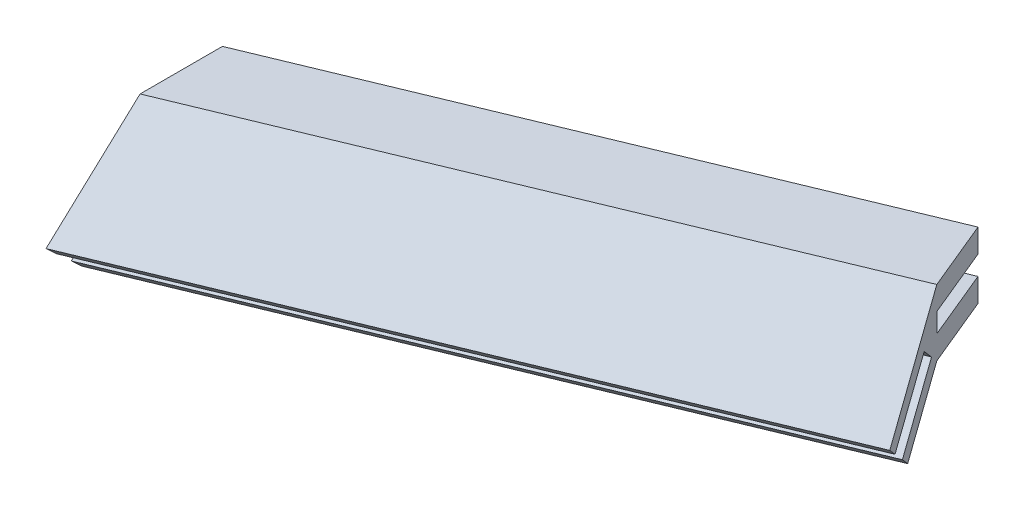
ISO-10303-21;
HEADER;
FILE_DESCRIPTION(('STEP AP214'),'2;1');
FILE_NAME('part.step','',(''),(''),'','','');
FILE_SCHEMA(('AUTOMOTIVE_DESIGN { 1 0 10303 214 1 1 1 1 }'));
ENDSEC;
DATA;
#1=APPLICATION_CONTEXT('core data for automotive mechanical design processes');
#2=APPLICATION_PROTOCOL_DEFINITION('international standard','automotive_design',2000,#1);
#3=PRODUCT_CONTEXT('',#1,'mechanical');
#4=PRODUCT('Part','Part','',(#3));
#5=PRODUCT_RELATED_PRODUCT_CATEGORY('part','',(#4));
#6=PRODUCT_DEFINITION_FORMATION('','',#4);
#7=PRODUCT_DEFINITION_CONTEXT('part definition',#1,'design');
#8=PRODUCT_DEFINITION('design','',#6,#7);
#9=PRODUCT_DEFINITION_SHAPE('','',#8);
#10=(LENGTH_UNIT() NAMED_UNIT(*) SI_UNIT(.MILLI.,.METRE.));
#11=(NAMED_UNIT(*) PLANE_ANGLE_UNIT() SI_UNIT($,.RADIAN.));
#12=(NAMED_UNIT(*) SI_UNIT($,.STERADIAN.) SOLID_ANGLE_UNIT());
#13=UNCERTAINTY_MEASURE_WITH_UNIT(LENGTH_MEASURE(1.E-05),#10,'distance_accuracy_value','');
#14=(GEOMETRIC_REPRESENTATION_CONTEXT(3) GLOBAL_UNCERTAINTY_ASSIGNED_CONTEXT((#13)) GLOBAL_UNIT_ASSIGNED_CONTEXT((#10,
#11,#12)) REPRESENTATION_CONTEXT('',''));
#15=CARTESIAN_POINT('',(0.,0.,0.));
#16=DIRECTION('',(0.,0.,1.));
#17=DIRECTION('',(1.,0.,0.));
#18=AXIS2_PLACEMENT_3D('',#15,#16,#17);
#19=CARTESIAN_POINT('',(-13.972297336363,38.284271247462,187.216606807487));
#20=DIRECTION('',(0.2705980500731,0.707106781186546,0.653281482438189));
#21=DIRECTION('',(0.,-0.678598344545848,0.734509555267754));
#22=AXIS2_PLACEMENT_3D('',#19,#20,#21);
#23=PLANE('',#22);
#24=DIRECTION('',(0.270598050073098,-0.707106781186549,0.653281482438187));
#25=VECTOR('',#24,1.);
#26=CARTESIAN_POINT('',(88.7481412148404,38.284271247462,144.668408026667));
#27=LINE('',#26,#25);
#28=CARTESIAN_POINT('',(93.0724640005659,26.9842712474619,155.108246744044));
#29=VERTEX_POINT('',#28);
#30=CARTESIAN_POINT('',(96.5902386515162,17.7918830920368,163.600906015741));
#31=VERTEX_POINT('',#30);
#32=EDGE_CURVE('E47',#29,#31,#27,.T.);
#33=ORIENTED_EDGE('',*,*,#32,.T.);
#34=DIRECTION('',(0.923879532511287,0.,-0.38268343236509));
#35=VECTOR('',#34,1.);
#36=CARTESIAN_POINT('',(-10.4545226854128,17.7918830920367,207.940297942488));
#37=LINE('',#36,#35);
#38=CARTESIAN_POINT('',(-3.14837533343908,17.7918830920367,204.913992620604));
#39=VERTEX_POINT('',#38);
#40=EDGE_CURVE('E62',#39,#31,#37,.T.);
#41=ORIENTED_EDGE('',*,*,#40,.F.);
#42=DIRECTION('',(0.,0.678598344545848,-0.734509555267754));
#43=VECTOR('',#42,1.);
#44=CARTESIAN_POINT('',(-3.14837533343908,-8.0485775527046,232.883505674435));
#45=LINE('',#44,#43);
#46=CARTESIAN_POINT('',(-3.14837533343907,26.9842712474619,194.964223379112));
#47=VERTEX_POINT('',#46);
#48=EDGE_CURVE('E176',#39,#47,#45,.T.);
#49=ORIENTED_EDGE('',*,*,#48,.T.);
#50=DIRECTION('',(0.923879532511287,0.,-0.38268343236509));
#51=VECTOR('',#50,1.);
#52=CARTESIAN_POINT('',(-13.972297336363,26.9842712474619,199.447638670791));
#53=LINE('',#52,#51);
#54=EDGE_CURVE('E170',#47,#29,#53,.T.);
#55=ORIENTED_EDGE('',*,*,#54,.T.);
#56=EDGE_LOOP('',(#33,#41,#49,#55));
#57=FACE_BOUND('',#56,.T.);
#58=ADVANCED_FACE('F38',(#57),#23,.F.);
#59=CARTESIAN_POINT('',(93.0724640005659,38.284271247462,155.108246744044));
#60=DIRECTION('',(-0.270598050073099,-0.707106781186546,-0.653281482438189));
#61=DIRECTION('',(0.,0.678598344545848,-0.734509555267754));
#62=AXIS2_PLACEMENT_3D('',#59,#60,#61);
#63=PLANE('',#62);
#64=DIRECTION('',(0.,-0.678598344545848,0.734509555267754));
#65=VECTOR('',#64,1.);
#66=CARTESIAN_POINT('',(-3.14837533343908,-5.16386609532728,241.992148356179));
#67=LINE('',#66,#65);
#68=CARTESIAN_POINT('',(-3.14837533343907,38.284271247462,194.964223379112));
#69=VERTEX_POINT('',#68);
#70=CARTESIAN_POINT('',(-3.14837533343908,23.4418830920367,211.029508552256));
#71=VERTEX_POINT('',#70);
#72=EDGE_CURVE('E182',#69,#71,#67,.T.);
#73=ORIENTED_EDGE('',*,*,#72,.T.);
#74=DIRECTION('',(0.923879532511287,0.,-0.38268343236509));
#75=VECTOR('',#74,1.);
#76=CARTESIAN_POINT('',(-8.29236129255004,23.4418830920367,213.160217301176));
#77=LINE('',#76,#75);
#78=CARTESIAN_POINT('',(98.7524000443789,23.4418830920367,168.820825374429));
#79=VERTEX_POINT('',#78);
#80=EDGE_CURVE('E224',#71,#79,#77,.T.);
#81=ORIENTED_EDGE('',*,*,#80,.T.);
#82=DIRECTION('',(0.270598050073098,-0.707106781186549,0.653281482438187));
#83=VECTOR('',#82,1.);
#84=CARTESIAN_POINT('',(93.0724640005659,38.284271247462,155.108246744044));
#85=LINE('',#84,#83);
#86=CARTESIAN_POINT('',(93.0724640005659,38.284271247462,155.108246744044));
#87=VERTEX_POINT('',#86);
#88=EDGE_CURVE('E11',#87,#79,#85,.T.);
#89=ORIENTED_EDGE('',*,*,#88,.F.);
#90=DIRECTION('',(0.923879532511287,0.,-0.38268343236509));
#91=VECTOR('',#90,1.);
#92=CARTESIAN_POINT('',(93.0724640005659,38.284271247462,155.108246744044));
#93=LINE('',#92,#91);
#94=EDGE_CURVE('E167',#69,#87,#93,.T.);
#95=ORIENTED_EDGE('',*,*,#94,.F.);
#96=EDGE_LOOP('',(#73,#81,#89,#95));
#97=FACE_BOUND('',#96,.T.);
#98=ADVANCED_FACE('F326',(#97),#63,.F.);
#99=CARTESIAN_POINT('',(-3.14837533343908,0.,225.578897968319));
#100=DIRECTION('',(1.,0.,0.));
#101=DIRECTION('',(0.,0.,-1.));
#102=AXIS2_PLACEMENT_3D('',#99,#100,#101);
#103=PLANE('',#102);
#104=DIRECTION('',(0.,0.,-1.));
#105=VECTOR('',#104,1.);
#106=CARTESIAN_POINT('',(-3.14837533343908,30.9842712474619,225.578897968319));
#107=LINE('',#106,#105);
#108=CARTESIAN_POINT('',(-3.14837533343907,30.9842712474619,194.964223379112));
#109=VERTEX_POINT('',#108);
#110=CARTESIAN_POINT('',(-3.14837533343908,30.9842712474619,180.89312477531));
#111=VERTEX_POINT('',#110);
#112=EDGE_CURVE('E203',#109,#111,#107,.T.);
#113=ORIENTED_EDGE('',*,*,#112,.T.);
#114=DIRECTION('',(0.,-1.,0.));
#115=VECTOR('',#114,1.);
#116=CARTESIAN_POINT('',(-3.14837533343908,0.,180.89312477531));
#117=LINE('',#116,#115);
#118=CARTESIAN_POINT('',(-3.14837533343907,26.9842712474619,180.89312477531));
#119=VERTEX_POINT('',#118);
#120=EDGE_CURVE('E268',#111,#119,#117,.T.);
#121=ORIENTED_EDGE('',*,*,#120,.T.);
#122=DIRECTION('',(0.,0.,1.));
#123=VECTOR('',#122,1.);
#124=CARTESIAN_POINT('',(-3.14837533343907,26.9842712474619,194.964223379112));
#125=LINE('',#124,#123);
#126=EDGE_CURVE('E262',#119,#47,#125,.T.);
#127=ORIENTED_EDGE('',*,*,#126,.T.);
#128=ORIENTED_EDGE('',*,*,#48,.F.);
#129=DIRECTION('',(0.,0.678598344545844,0.734509555267758));
#130=VECTOR('',#129,1.);
#131=CARTESIAN_POINT('',(-3.14837533343908,19.8989499688856,207.1946653736));
#132=LINE('',#131,#130);
#133=CARTESIAN_POINT('',(-3.14837533343908,19.4535840278251,206.71260475272));
#134=VERTEX_POINT('',#133);
#135=EDGE_CURVE('E228',#39,#134,#132,.T.);
#136=ORIENTED_EDGE('',*,*,#135,.T.);
#137=DIRECTION('',(0.,0.678598344545852,-0.734509555267751));
#138=VECTOR('',#137,1.);
#139=CARTESIAN_POINT('',(-3.14837533343908,1.09163398359335,226.587436262755));
#140=LINE('',#139,#138);
#141=CARTESIAN_POINT('',(-3.14837533343908,28.6459721832503,196.762835511228));
#142=VERTEX_POINT('',#141);
#143=EDGE_CURVE('E246',#134,#142,#140,.T.);
#144=ORIENTED_EDGE('',*,*,#143,.T.);
#145=DIRECTION('',(0.,0.678598344545836,0.734509555267766));
#146=VECTOR('',#145,1.);
#147=CARTESIAN_POINT('',(-3.14837533343908,29.8176156000743,198.031013207122));
#148=LINE('',#147,#146);
#149=CARTESIAN_POINT('',(-3.14837533343908,30.9725703116735,199.281127178648));
#150=VERTEX_POINT('',#149);
#151=EDGE_CURVE('E250',#142,#150,#148,.T.);
#152=ORIENTED_EDGE('',*,*,#151,.T.);
#153=DIRECTION('',(0.,-0.678598344545855,0.734509555267749));
#154=VECTOR('',#153,1.);
#155=CARTESIAN_POINT('',(-3.14837533343908,3.60205331138888,228.906761297726));
#156=LINE('',#155,#154);
#157=CARTESIAN_POINT('',(-3.14837533343908,21.7801821562483,209.23089642014));
#158=VERTEX_POINT('',#157);
#159=EDGE_CURVE('E254',#150,#158,#156,.T.);
#160=ORIENTED_EDGE('',*,*,#159,.T.);
#161=DIRECTION('',(0.,0.678598344545844,0.734509555267758));
#162=VECTOR('',#161,1.);
#163=CARTESIAN_POINT('',(-3.14837533343908,19.8989499688856,207.1946653736));
#164=LINE('',#163,#162);
#165=EDGE_CURVE('E258',#158,#71,#164,.T.);
#166=ORIENTED_EDGE('',*,*,#165,.T.);
#167=ORIENTED_EDGE('',*,*,#72,.F.);
#168=DIRECTION('',(0.,0.,1.));
#169=VECTOR('',#168,1.);
#170=CARTESIAN_POINT('',(-3.14837533343907,38.284271247462,194.964223379112));
#171=LINE('',#170,#169);
#172=CARTESIAN_POINT('',(-3.14837533343908,38.284271247462,180.89312477531));
#173=VERTEX_POINT('',#172);
#174=EDGE_CURVE('E178',#173,#69,#171,.T.);
#175=ORIENTED_EDGE('',*,*,#174,.F.);
#176=DIRECTION('',(0.,-1.,0.));
#177=VECTOR('',#176,1.);
#178=CARTESIAN_POINT('',(-3.14837533343908,0.,180.89312477531));
#179=LINE('',#178,#177);
#180=CARTESIAN_POINT('',(-3.14837533343907,34.284271247462,180.89312477531));
#181=VERTEX_POINT('',#180);
#182=EDGE_CURVE('E148',#173,#181,#179,.T.);
#183=ORIENTED_EDGE('',*,*,#182,.T.);
#184=DIRECTION('',(0.,0.,1.));
#185=VECTOR('',#184,1.);
#186=CARTESIAN_POINT('',(-3.14837533343908,34.284271247462,225.578897968319));
#187=LINE('',#186,#185);
#188=CARTESIAN_POINT('',(-3.14837533343908,34.284271247462,194.964223379112));
#189=VERTEX_POINT('',#188);
#190=EDGE_CURVE('E292',#181,#189,#187,.T.);
#191=ORIENTED_EDGE('',*,*,#190,.T.);
#192=DIRECTION('',(0.,-1.,0.));
#193=VECTOR('',#192,1.);
#194=CARTESIAN_POINT('',(-3.14837533343908,0.,194.964223379112));
#195=LINE('',#194,#193);
#196=EDGE_CURVE('E210',#189,#109,#195,.T.);
#197=ORIENTED_EDGE('',*,*,#196,.T.);
#198=EDGE_LOOP('',(#113,#121,#127,#128,#136,#144,#152,#160,#166,#167,#175,#183,#191,#197));
#199=FACE_BOUND('',#198,.T.);
#200=ADVANCED_FACE('F40',(#199),#103,.F.);
#201=CARTESIAN_POINT('',(103.89638600349,0.,181.239506041572));
#202=DIRECTION('',(-0.923879532511287,0.,0.38268343236509));
#203=DIRECTION('',(0.38268343236509,0.,0.923879532511287));
#204=AXIS2_PLACEMENT_3D('',#201,#202,#203);
#205=PLANE('',#204);
#206=DIRECTION('',(0.38268343236509,0.,0.923879532511287));
#207=VECTOR('',#206,1.);
#208=CARTESIAN_POINT('',(75.8517095441369,26.9842712474619,113.533667781036));
#209=LINE('',#208,#207);
#210=CARTESIAN_POINT('',(88.0975793798197,26.9842712474619,143.097812821397));
#211=VERTEX_POINT('',#210);
#212=EDGE_CURVE('E171',#211,#29,#209,.T.);
#213=ORIENTED_EDGE('',*,*,#212,.F.);
#214=DIRECTION('',(0.,-1.,0.));
#215=VECTOR('',#214,1.);
#216=CARTESIAN_POINT('',(88.0975793798197,30.9842712474619,143.097812821397));
#217=LINE('',#216,#215);
#218=CARTESIAN_POINT('',(88.0975793798197,30.9842712474619,143.097812821397));
#219=VERTEX_POINT('',#218);
#220=EDGE_CURVE('E54',#219,#211,#217,.T.);
#221=ORIENTED_EDGE('',*,*,#220,.F.);
#222=DIRECTION('',(-0.38268343236509,0.,-0.923879532511287));
#223=VECTOR('',#222,1.);
#224=CARTESIAN_POINT('',(93.0724640005659,30.9842712474619,155.108246744044));
#225=LINE('',#224,#223);
#226=CARTESIAN_POINT('',(93.0724640005659,30.9842712474619,155.108246744044));
#227=VERTEX_POINT('',#226);
#228=EDGE_CURVE('E309',#227,#219,#225,.T.);
#229=ORIENTED_EDGE('',*,*,#228,.F.);
#230=DIRECTION('',(0.,-1.,0.));
#231=VECTOR('',#230,1.);
#232=CARTESIAN_POINT('',(93.0724640005659,34.284271247462,155.108246744044));
#233=LINE('',#232,#231);
#234=CARTESIAN_POINT('',(93.0724640005659,34.284271247462,155.108246744044));
#235=VERTEX_POINT('',#234);
#236=EDGE_CURVE('E305',#235,#227,#233,.T.);
#237=ORIENTED_EDGE('',*,*,#236,.F.);
#238=DIRECTION('',(0.38268343236509,0.,0.923879532511287));
#239=VECTOR('',#238,1.);
#240=CARTESIAN_POINT('',(88.0975793798197,34.284271247462,143.097812821397));
#241=LINE('',#240,#239);
#242=CARTESIAN_POINT('',(88.0975793798197,34.284271247462,143.097812821397));
#243=VERTEX_POINT('',#242);
#244=EDGE_CURVE('E162',#243,#235,#241,.T.);
#245=ORIENTED_EDGE('',*,*,#244,.F.);
#246=DIRECTION('',(0.,-1.,0.));
#247=VECTOR('',#246,1.);
#248=CARTESIAN_POINT('',(88.0975793798197,38.284271247462,143.097812821397));
#249=LINE('',#248,#247);
#250=CARTESIAN_POINT('',(88.0975793798197,38.284271247462,143.097812821397));
#251=VERTEX_POINT('',#250);
#252=EDGE_CURVE('E145',#251,#243,#249,.T.);
#253=ORIENTED_EDGE('',*,*,#252,.F.);
#254=DIRECTION('',(0.38268343236509,0.,0.923879532511287));
#255=VECTOR('',#254,1.);
#256=CARTESIAN_POINT('',(75.8517095441369,38.284271247462,113.533667781036));
#257=LINE('',#256,#255);
#258=EDGE_CURVE('E158',#251,#87,#257,.T.);
#259=ORIENTED_EDGE('',*,*,#258,.T.);
#260=ORIENTED_EDGE('',*,*,#88,.T.);
#261=DIRECTION('',(0.270598050073096,0.707106781186544,0.653281482438193));
#262=VECTOR('',#261,1.);
#263=CARTESIAN_POINT('',(98.1164946267071,21.7801821562483,167.2856138907));
#264=LINE('',#263,#262);
#265=CARTESIAN_POINT('',(98.1164946267071,21.7801821562483,167.2856138907));
#266=VERTEX_POINT('',#265);
#267=EDGE_CURVE('E221',#266,#79,#264,.T.);
#268=ORIENTED_EDGE('',*,*,#267,.F.);
#269=DIRECTION('',(0.270598050073096,-0.707106781186555,0.653281482438181));
#270=VECTOR('',#269,1.);
#271=CARTESIAN_POINT('',(94.5987199757569,30.9725703116735,158.792954619003));
#272=LINE('',#271,#270);
#273=CARTESIAN_POINT('',(94.5987199757569,30.9725703116735,158.792954619003));
#274=VERTEX_POINT('',#273);
#275=EDGE_CURVE('E217',#274,#266,#272,.T.);
#276=ORIENTED_EDGE('',*,*,#275,.F.);
#277=DIRECTION('',(0.270598050073099,0.707106781186537,0.6532814824382));
#278=VECTOR('',#277,1.);
#279=CARTESIAN_POINT('',(93.7083694182377,28.6459721832503,156.643458227774));
#280=LINE('',#279,#278);
#281=CARTESIAN_POINT('',(93.7083694182377,28.6459721832503,156.643458227774));
#282=VERTEX_POINT('',#281);
#283=EDGE_CURVE('E207',#282,#274,#280,.T.);
#284=ORIENTED_EDGE('',*,*,#283,.F.);
#285=DIRECTION('',(-0.270598050073096,0.707106781186553,-0.653281482438184));
#286=VECTOR('',#285,1.);
#287=CARTESIAN_POINT('',(97.2261440691879,19.4535840278251,165.13611749947));
#288=LINE('',#287,#286);
#289=CARTESIAN_POINT('',(97.2261440691879,19.4535840278251,165.13611749947));
#290=VERTEX_POINT('',#289);
#291=EDGE_CURVE('E200',#290,#282,#288,.T.);
#292=ORIENTED_EDGE('',*,*,#291,.F.);
#293=DIRECTION('',(0.270598050073096,0.707106781186544,0.653281482438193));
#294=VECTOR('',#293,1.);
#295=CARTESIAN_POINT('',(96.5902386515162,17.7918830920367,163.600906015741));
#296=LINE('',#295,#294);
#297=EDGE_CURVE('E197',#31,#290,#296,.T.);
#298=ORIENTED_EDGE('',*,*,#297,.F.);
#299=ORIENTED_EDGE('',*,*,#32,.F.);
#300=EDGE_LOOP('',(#213,#221,#229,#237,#245,#253,#259,#260,#268,#276,#284,#292,#298,#299));
#301=FACE_BOUND('',#300,.T.);
#302=ADVANCED_FACE('F157',(#301),#205,.F.);
#303=CARTESIAN_POINT('',(-20.3691297898681,38.284271247462,153.389644416104));
#304=DIRECTION('',(0.,-1.,0.));
#305=DIRECTION('',(0.,0.,-1.));
#306=AXIS2_PLACEMENT_3D('',#303,#304,#305);
#307=PLANE('',#306);
#308=ORIENTED_EDGE('',*,*,#258,.F.);
#309=DIRECTION('',(0.923879532511287,0.,-0.38268343236509));
#310=VECTOR('',#309,1.);
#311=CARTESIAN_POINT('',(-13.8031959979982,38.284271247462,185.306495999224));
#312=LINE('',#311,#310);
#313=EDGE_CURVE('E141',#173,#251,#312,.T.);
#314=ORIENTED_EDGE('',*,*,#313,.F.);
#315=ORIENTED_EDGE('',*,*,#174,.T.);
#316=ORIENTED_EDGE('',*,*,#94,.T.);
#317=EDGE_LOOP('',(#308,#314,#315,#316));
#318=FACE_BOUND('',#317,.T.);
#319=ADVANCED_FACE('F165',(#318),#307,.F.);
#320=CARTESIAN_POINT('',(75.8517095441369,26.9842712474619,113.533667781036));
#321=DIRECTION('',(0.,1.,0.));
#322=DIRECTION('',(0.,0.,1.));
#323=AXIS2_PLACEMENT_3D('',#320,#321,#322);
#324=PLANE('',#323);
#325=ORIENTED_EDGE('',*,*,#126,.F.);
#326=DIRECTION('',(0.923879532511287,0.,-0.38268343236509));
#327=VECTOR('',#326,1.);
#328=CARTESIAN_POINT('',(-13.8031959979982,26.9842712474619,185.306495999224));
#329=LINE('',#328,#327);
#330=EDGE_CURVE('E271',#119,#211,#329,.T.);
#331=ORIENTED_EDGE('',*,*,#330,.T.);
#332=ORIENTED_EDGE('',*,*,#212,.T.);
#333=ORIENTED_EDGE('',*,*,#54,.F.);
#334=EDGE_LOOP('',(#325,#331,#332,#333));
#335=FACE_BOUND('',#334,.T.);
#336=ADVANCED_FACE('F270',(#335),#324,.F.);
#337=CARTESIAN_POINT('',(-8.92826671022182,21.7801821562483,211.625005817447));
#338=DIRECTION('',(-0.270598050073097,0.707106781186551,-0.653281482438185));
#339=DIRECTION('',(0.,0.678598344545844,0.734509555267758));
#340=AXIS2_PLACEMENT_3D('',#337,#338,#339);
#341=PLANE('',#340);
#342=DIRECTION('',(0.923879532511287,0.,-0.38268343236509));
#343=VECTOR('',#342,1.);
#344=CARTESIAN_POINT('',(-8.92826671022182,21.7801821562483,211.625005817447));
#345=LINE('',#344,#343);
#346=EDGE_CURVE('E229',#158,#266,#345,.T.);
#347=ORIENTED_EDGE('',*,*,#346,.T.);
#348=ORIENTED_EDGE('',*,*,#267,.T.);
#349=ORIENTED_EDGE('',*,*,#80,.F.);
#350=ORIENTED_EDGE('',*,*,#165,.F.);
#351=EDGE_LOOP('',(#347,#348,#349,#350));
#352=FACE_BOUND('',#351,.T.);
#353=ADVANCED_FACE('F380',(#352),#341,.F.);
#354=CARTESIAN_POINT('',(-12.4460413611721,30.9725703116735,203.13234654575));
#355=DIRECTION('',(0.270598050073101,0.70710678118654,0.653281482438195));
#356=DIRECTION('',(0.,-0.678598344545855,0.734509555267749));
#357=AXIS2_PLACEMENT_3D('',#354,#355,#356);
#358=PLANE('',#357);
#359=DIRECTION('',(0.923879532511287,0.,-0.38268343236509));
#360=VECTOR('',#359,1.);
#361=CARTESIAN_POINT('',(-12.4460413611721,30.9725703116735,203.13234654575));
#362=LINE('',#361,#360);
#363=EDGE_CURVE('E232',#150,#274,#362,.T.);
#364=ORIENTED_EDGE('',*,*,#363,.T.);
#365=ORIENTED_EDGE('',*,*,#275,.T.);
#366=ORIENTED_EDGE('',*,*,#346,.F.);
#367=ORIENTED_EDGE('',*,*,#159,.F.);
#368=EDGE_LOOP('',(#364,#365,#366,#367));
#369=FACE_BOUND('',#368,.T.);
#370=ADVANCED_FACE('F370',(#369),#358,.F.);
#371=CARTESIAN_POINT('',(-13.3363919186913,28.6459721832503,200.982850154521));
#372=DIRECTION('',(-0.270598050073094,0.707106781186558,-0.653281482438178));
#373=DIRECTION('',(0.,0.678598344545836,0.734509555267766));
#374=AXIS2_PLACEMENT_3D('',#371,#372,#373);
#375=PLANE('',#374);
#376=DIRECTION('',(0.923879532511287,0.,-0.38268343236509));
#377=VECTOR('',#376,1.);
#378=CARTESIAN_POINT('',(-13.3363919186913,28.6459721832503,200.982850154521));
#379=LINE('',#378,#377);
#380=EDGE_CURVE('E235',#142,#282,#379,.T.);
#381=ORIENTED_EDGE('',*,*,#380,.T.);
#382=ORIENTED_EDGE('',*,*,#283,.T.);
#383=ORIENTED_EDGE('',*,*,#363,.F.);
#384=ORIENTED_EDGE('',*,*,#151,.F.);
#385=EDGE_LOOP('',(#381,#382,#383,#384));
#386=FACE_BOUND('',#385,.T.);
#387=ADVANCED_FACE('F360',(#386),#375,.F.);
#388=CARTESIAN_POINT('',(-9.81861726774101,19.4535840278251,209.475509426217));
#389=DIRECTION('',(-0.2705980500731,-0.707106781186542,-0.653281482438193));
#390=DIRECTION('',(0.,0.678598344545852,-0.734509555267751));
#391=AXIS2_PLACEMENT_3D('',#388,#389,#390);
#392=PLANE('',#391);
#393=DIRECTION('',(0.923879532511287,0.,-0.38268343236509));
#394=VECTOR('',#393,1.);
#395=CARTESIAN_POINT('',(-9.81861726774101,19.4535840278251,209.475509426217));
#396=LINE('',#395,#394);
#397=EDGE_CURVE('E238',#134,#290,#396,.T.);
#398=ORIENTED_EDGE('',*,*,#397,.T.);
#399=ORIENTED_EDGE('',*,*,#291,.T.);
#400=ORIENTED_EDGE('',*,*,#380,.F.);
#401=ORIENTED_EDGE('',*,*,#143,.F.);
#402=EDGE_LOOP('',(#398,#399,#400,#401));
#403=FACE_BOUND('',#402,.T.);
#404=ADVANCED_FACE('F349',(#403),#392,.F.);
#405=CARTESIAN_POINT('',(-10.4545226854128,17.7918830920367,207.940297942488));
#406=DIRECTION('',(-0.270598050073097,0.707106781186551,-0.653281482438185));
#407=DIRECTION('',(0.,0.678598344545844,0.734509555267758));
#408=AXIS2_PLACEMENT_3D('',#405,#406,#407);
#409=PLANE('',#408);
#410=ORIENTED_EDGE('',*,*,#40,.T.);
#411=ORIENTED_EDGE('',*,*,#297,.T.);
#412=ORIENTED_EDGE('',*,*,#397,.F.);
#413=ORIENTED_EDGE('',*,*,#135,.F.);
#414=EDGE_LOOP('',(#410,#411,#412,#413));
#415=FACE_BOUND('',#414,.T.);
#416=ADVANCED_FACE('F344',(#415),#409,.F.);
#417=CARTESIAN_POINT('',(-8.82831137725207,30.9842712474619,197.316929921871));
#418=DIRECTION('',(0.,-1.,0.));
#419=DIRECTION('',(0.,0.,-1.));
#420=AXIS2_PLACEMENT_3D('',#417,#418,#419);
#421=PLANE('',#420);
#422=DIRECTION('',(0.923879532511287,0.,-0.38268343236509));
#423=VECTOR('',#422,1.);
#424=CARTESIAN_POINT('',(-8.82831137725207,30.9842712474619,197.316929921871));
#425=LINE('',#424,#423);
#426=EDGE_CURVE('E278',#109,#227,#425,.T.);
#427=ORIENTED_EDGE('',*,*,#426,.T.);
#428=ORIENTED_EDGE('',*,*,#228,.T.);
#429=DIRECTION('',(0.923879532511287,0.,-0.38268343236509));
#430=VECTOR('',#429,1.);
#431=CARTESIAN_POINT('',(-13.8031959979982,30.9842712474619,185.306495999224));
#432=LINE('',#431,#430);
#433=EDGE_CURVE('E273',#111,#219,#432,.T.);
#434=ORIENTED_EDGE('',*,*,#433,.F.);
#435=ORIENTED_EDGE('',*,*,#112,.F.);
#436=EDGE_LOOP('',(#427,#428,#434,#435));
#437=FACE_BOUND('',#436,.T.);
#438=ADVANCED_FACE('F316',(#437),#421,.F.);
#439=CARTESIAN_POINT('',(-8.82831137725207,34.284271247462,197.316929921871));
#440=DIRECTION('',(0.38268343236509,0.,0.923879532511287));
#441=DIRECTION('',(0.923879532511287,0.,-0.38268343236509));
#442=AXIS2_PLACEMENT_3D('',#439,#440,#441);
#443=PLANE('',#442);
#444=DIRECTION('',(0.923879532511287,0.,-0.38268343236509));
#445=VECTOR('',#444,1.);
#446=CARTESIAN_POINT('',(-8.82831137725207,34.284271247462,197.316929921871));
#447=LINE('',#446,#445);
#448=EDGE_CURVE('E285',#189,#235,#447,.T.);
#449=ORIENTED_EDGE('',*,*,#448,.T.);
#450=ORIENTED_EDGE('',*,*,#236,.T.);
#451=ORIENTED_EDGE('',*,*,#426,.F.);
#452=ORIENTED_EDGE('',*,*,#196,.F.);
#453=EDGE_LOOP('',(#449,#450,#451,#452));
#454=FACE_BOUND('',#453,.T.);
#455=ADVANCED_FACE('F300',(#454),#443,.F.);
#456=CARTESIAN_POINT('',(-13.8031959979982,34.284271247462,185.306495999224));
#457=DIRECTION('',(0.,1.,0.));
#458=DIRECTION('',(0.,0.,1.));
#459=AXIS2_PLACEMENT_3D('',#456,#457,#458);
#460=PLANE('',#459);
#461=DIRECTION('',(0.923879532511287,0.,-0.38268343236509));
#462=VECTOR('',#461,1.);
#463=CARTESIAN_POINT('',(-13.8031959979982,34.284271247462,185.306495999224));
#464=LINE('',#463,#462);
#465=EDGE_CURVE('E153',#181,#243,#464,.T.);
#466=ORIENTED_EDGE('',*,*,#465,.T.);
#467=ORIENTED_EDGE('',*,*,#244,.T.);
#468=ORIENTED_EDGE('',*,*,#448,.F.);
#469=ORIENTED_EDGE('',*,*,#190,.F.);
#470=EDGE_LOOP('',(#466,#467,#468,#469));
#471=FACE_BOUND('',#470,.T.);
#472=ADVANCED_FACE('F303',(#471),#460,.F.);
#473=CARTESIAN_POINT('',(-13.8031959979982,38.284271247462,185.306495999224));
#474=DIRECTION('',(0.38268343236509,0.,0.923879532511287));
#475=DIRECTION('',(0.923879532511287,0.,-0.38268343236509));
#476=AXIS2_PLACEMENT_3D('',#473,#474,#475);
#477=PLANE('',#476);
#478=ORIENTED_EDGE('',*,*,#313,.T.);
#479=ORIENTED_EDGE('',*,*,#252,.T.);
#480=ORIENTED_EDGE('',*,*,#465,.F.);
#481=ORIENTED_EDGE('',*,*,#182,.F.);
#482=EDGE_LOOP('',(#478,#479,#480,#481));
#483=FACE_BOUND('',#482,.T.);
#484=ADVANCED_FACE('F143',(#483),#477,.F.);
#485=CARTESIAN_POINT('',(-13.8031959979982,30.9842712474619,185.306495999224));
#486=DIRECTION('',(0.38268343236509,0.,0.923879532511287));
#487=DIRECTION('',(0.923879532511287,0.,-0.38268343236509));
#488=AXIS2_PLACEMENT_3D('',#485,#486,#487);
#489=PLANE('',#488);
#490=ORIENTED_EDGE('',*,*,#433,.T.);
#491=ORIENTED_EDGE('',*,*,#220,.T.);
#492=ORIENTED_EDGE('',*,*,#330,.F.);
#493=ORIENTED_EDGE('',*,*,#120,.F.);
#494=EDGE_LOOP('',(#490,#491,#492,#493));
#495=FACE_BOUND('',#494,.T.);
#496=ADVANCED_FACE('F317',(#495),#489,.F.);
#497=CLOSED_SHELL('',(#58,#98,#200,#302,#319,#336,#353,#370,#387,#404,#416,#438,#455,#472,#484,#496));
#498=MANIFOLD_SOLID_BREP('B2',#497);
#499=ADVANCED_BREP_SHAPE_REPRESENTATION('',(#18,#498),#14);
#500=SHAPE_DEFINITION_REPRESENTATION(#9,#499);
ENDSEC;
END-ISO-10303-21;
